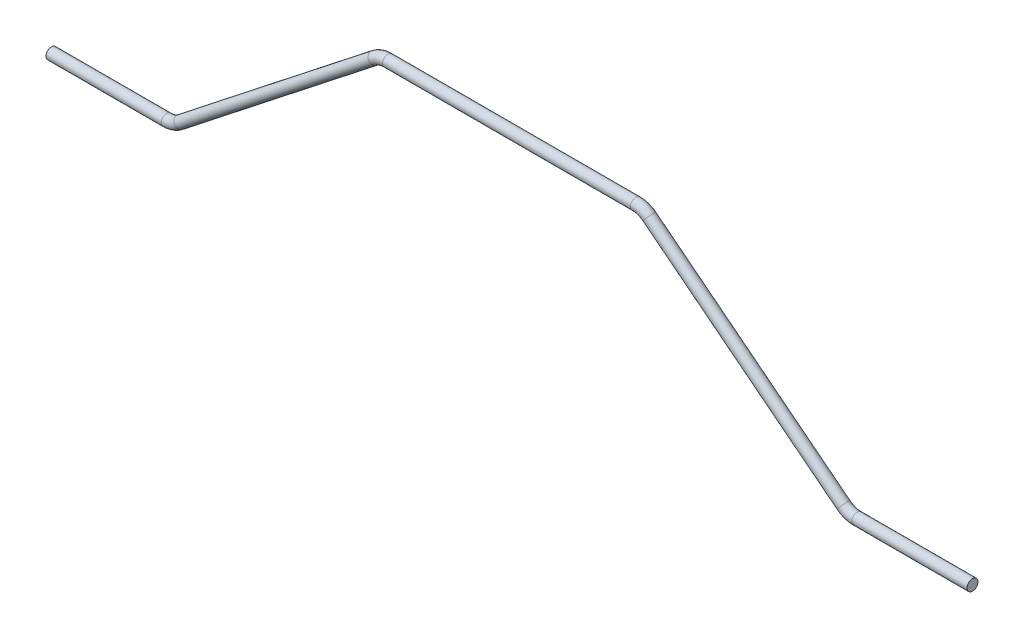
ISO-10303-21;
HEADER;
FILE_DESCRIPTION(('STEP AP214'),'2;1');
FILE_NAME('part.step','',(''),(''),'','','');
FILE_SCHEMA(('AUTOMOTIVE_DESIGN { 1 0 10303 214 1 1 1 1 }'));
ENDSEC;
DATA;
#1=APPLICATION_CONTEXT('core data for automotive mechanical design processes');
#2=APPLICATION_PROTOCOL_DEFINITION('international standard','automotive_design',2000,#1);
#3=PRODUCT_CONTEXT('',#1,'mechanical');
#4=PRODUCT('Part','Part','',(#3));
#5=PRODUCT_RELATED_PRODUCT_CATEGORY('part','',(#4));
#6=PRODUCT_DEFINITION_FORMATION('','',#4);
#7=PRODUCT_DEFINITION_CONTEXT('part definition',#1,'design');
#8=PRODUCT_DEFINITION('design','',#6,#7);
#9=PRODUCT_DEFINITION_SHAPE('','',#8);
#10=(LENGTH_UNIT() NAMED_UNIT(*) SI_UNIT(.MILLI.,.METRE.));
#11=(NAMED_UNIT(*) PLANE_ANGLE_UNIT() SI_UNIT($,.RADIAN.));
#12=(NAMED_UNIT(*) SI_UNIT($,.STERADIAN.) SOLID_ANGLE_UNIT());
#13=UNCERTAINTY_MEASURE_WITH_UNIT(LENGTH_MEASURE(1.E-05),#10,'distance_accuracy_value','');
#14=(GEOMETRIC_REPRESENTATION_CONTEXT(3) GLOBAL_UNCERTAINTY_ASSIGNED_CONTEXT((#13)) GLOBAL_UNIT_ASSIGNED_CONTEXT((#10,
#11,#12)) REPRESENTATION_CONTEXT('',''));
#15=CARTESIAN_POINT('',(0.,0.,0.));
#16=DIRECTION('',(0.,0.,1.));
#17=DIRECTION('',(1.,0.,0.));
#18=AXIS2_PLACEMENT_3D('',#15,#16,#17);
#19=CARTESIAN_POINT('',(-210.,-73.928244598278,0.));
#20=DIRECTION('',(1.,0.,0.));
#21=DIRECTION('',(0.,0.,-1.));
#22=AXIS2_PLACEMENT_3D('',#19,#20,#21);
#23=PLANE('',#22);
#24=CARTESIAN_POINT('',(-210.,-73.928244598278,0.));
#25=DIRECTION('',(1.,0.,0.));
#26=DIRECTION('',(0.,0.,-1.));
#27=AXIS2_PLACEMENT_3D('',#24,#25,#26);
#28=CIRCLE('',#27,2.5);
#29=CARTESIAN_POINT('',(-210.,-73.928244598278,-2.5));
#30=VERTEX_POINT('',#29);
#31=EDGE_CURVE('E84',#30,#30,#28,.T.);
#32=ORIENTED_EDGE('',*,*,#31,.F.);
#33=EDGE_LOOP('',(#32));
#34=FACE_BOUND('',#33,.T.);
#35=ADVANCED_FACE('F41',(#34),#23,.F.);
#36=CARTESIAN_POINT('',(210.,-73.9282445982782,0.));
#37=DIRECTION('',(1.,0.,0.));
#38=DIRECTION('',(0.,0.,-1.));
#39=AXIS2_PLACEMENT_3D('',#36,#37,#38);
#40=PLANE('',#39);
#41=CARTESIAN_POINT('',(210.,-73.9282445982782,0.));
#42=DIRECTION('',(1.,0.,0.));
#43=DIRECTION('',(0.,0.,-1.));
#44=AXIS2_PLACEMENT_3D('',#41,#42,#43);
#45=CIRCLE('',#44,2.5);
#46=CARTESIAN_POINT('',(210.,-73.9282445982782,-2.5));
#47=VERTEX_POINT('',#46);
#48=EDGE_CURVE('E10',#47,#47,#45,.T.);
#49=ORIENTED_EDGE('',*,*,#48,.T.);
#50=EDGE_LOOP('',(#49));
#51=FACE_BOUND('',#50,.T.);
#52=ADVANCED_FACE('F92',(#51),#40,.T.);
#53=CARTESIAN_POINT('',(-210.,-73.928244598278,0.));
#54=DIRECTION('',(1.,0.,0.));
#55=DIRECTION('',(0.,1.,0.));
#56=AXIS2_PLACEMENT_3D('',#53,#54,#55);
#57=CYLINDRICAL_SURFACE('',#56,2.5);
#58=CARTESIAN_POINT('',(-157.459682683287,-73.9282445982781,0.));
#59=DIRECTION('',(1.,0.,0.));
#60=DIRECTION('',(0.,0.,-1.));
#61=AXIS2_PLACEMENT_3D('',#58,#59,#60);
#62=CIRCLE('',#61,2.5);
#63=CARTESIAN_POINT('',(-157.459682683287,-76.4282445982781,0.));
#64=VERTEX_POINT('',#63);
#65=EDGE_CURVE('E80',#64,#64,#62,.T.);
#66=ORIENTED_EDGE('',*,*,#65,.F.);
#67=EDGE_LOOP('',(#66));
#68=FACE_BOUND('',#67,.T.);
#69=ORIENTED_EDGE('',*,*,#31,.T.);
#70=EDGE_LOOP('',(#69));
#71=FACE_BOUND('',#70,.T.);
#72=ADVANCED_FACE('F89',(#68,#71),#57,.T.);
#73=CARTESIAN_POINT('',(-157.459682683287,-63.8857142857143,0.));
#74=DIRECTION('',(0.,0.,1.));
#75=DIRECTION('',(1.,0.,0.));
#76=AXIS2_PLACEMENT_3D('',#73,#74,#75);
#77=TOROIDAL_SURFACE('',#76,10.0425303125638,2.5);
#78=CARTESIAN_POINT('',(-151.253707319645,-71.7811740484287,0.));
#79=DIRECTION('',(0.786202233598109,0.61796929364277,0.));
#80=DIRECTION('',(0.,0.,-1.));
#81=AXIS2_PLACEMENT_3D('',#78,#79,#80);
#82=CIRCLE('',#81,2.5);
#83=CARTESIAN_POINT('',(-149.708784085539,-73.7466796324239,0.));
#84=VERTEX_POINT('',#83);
#85=EDGE_CURVE('E76',#84,#84,#82,.T.);
#86=CARTESIAN_POINT('',(-157.459682683287,-63.8857142857143,0.));
#87=DIRECTION('',(0.,0.,1.));
#88=DIRECTION('',(1.,0.,0.));
#89=AXIS2_PLACEMENT_3D('',#86,#87,#88);
#90=CIRCLE('',#89,12.5425303125638);
#91=EDGE_CURVE('',#64,#84,#90,.T.);
#92=ORIENTED_EDGE('',*,*,#65,.T.);
#93=ORIENTED_EDGE('',*,*,#85,.F.);
#94=ORIENTED_EDGE('',*,*,#91,.T.);
#95=ORIENTED_EDGE('',*,*,#91,.F.);
#96=EDGE_LOOP('',(#92,#94,#93,#95));
#97=FACE_BOUND('',#96,.T.);
#98=ADVANCED_FACE('F126',(#97),#77,.T.);
#99=CARTESIAN_POINT('',(-151.253707319646,-71.7811740484288,0.));
#100=DIRECTION('',(0.786202233598109,0.61796929364277,0.));
#101=DIRECTION('',(-0.61796929364277,0.786202233598109,0.));
#102=AXIS2_PLACEMENT_3D('',#99,#100,#101);
#103=CYLINDRICAL_SURFACE('',#102,2.5);
#104=CARTESIAN_POINT('',(-62.6937278259274,-2.17141509075233,0.));
#105=DIRECTION('',(0.78620223359811,0.61796929364277,0.));
#106=DIRECTION('',(0.,0.,-1.));
#107=AXIS2_PLACEMENT_3D('',#104,#105,#106);
#108=CIRCLE('',#107,2.5);
#109=CARTESIAN_POINT('',(-64.2386510600343,-0.205909506757062,0.));
#110=VERTEX_POINT('',#109);
#111=EDGE_CURVE('E72',#110,#110,#108,.T.);
#112=ORIENTED_EDGE('',*,*,#111,.F.);
#113=EDGE_LOOP('',(#112));
#114=FACE_BOUND('',#113,.T.);
#115=ORIENTED_EDGE('',*,*,#85,.T.);
#116=EDGE_LOOP('',(#115));
#117=FACE_BOUND('',#116,.T.);
#118=ADVANCED_FACE('F122',(#114,#117),#103,.T.);
#119=CARTESIAN_POINT('',(-56.5403173167131,-10.,0.));
#120=DIRECTION('',(0.,0.,-1.));
#121=DIRECTION('',(-1.,0.,0.));
#122=AXIS2_PLACEMENT_3D('',#119,#120,#121);
#123=TOROIDAL_SURFACE('',#122,9.9574696874361,2.5);
#124=CARTESIAN_POINT('',(-56.5403173167131,-0.0425303125638071,0.));
#125=DIRECTION('',(1.,0.,0.));
#126=DIRECTION('',(0.,0.,-1.));
#127=AXIS2_PLACEMENT_3D('',#124,#125,#126);
#128=CIRCLE('',#127,2.5);
#129=CARTESIAN_POINT('',(-56.5403173167131,2.45746968743609,0.));
#130=VERTEX_POINT('',#129);
#131=EDGE_CURVE('E68',#130,#130,#128,.T.);
#132=CARTESIAN_POINT('',(-56.5403173167131,-10.,0.));
#133=DIRECTION('',(0.,0.,-1.));
#134=DIRECTION('',(-1.,0.,0.));
#135=AXIS2_PLACEMENT_3D('',#132,#133,#134);
#136=CIRCLE('',#135,12.4574696874361);
#137=EDGE_CURVE('',#110,#130,#136,.T.);
#138=ORIENTED_EDGE('',*,*,#111,.T.);
#139=ORIENTED_EDGE('',*,*,#131,.F.);
#140=ORIENTED_EDGE('',*,*,#137,.T.);
#141=ORIENTED_EDGE('',*,*,#137,.F.);
#142=EDGE_LOOP('',(#138,#140,#139,#141));
#143=FACE_BOUND('',#142,.T.);
#144=ADVANCED_FACE('F118',(#143),#123,.T.);
#145=CARTESIAN_POINT('',(-56.5403173167131,-0.0425303125638349,0.));
#146=DIRECTION('',(1.,0.,0.));
#147=DIRECTION('',(0.,1.,0.));
#148=AXIS2_PLACEMENT_3D('',#145,#146,#147);
#149=CYLINDRICAL_SURFACE('',#148,2.5);
#150=CARTESIAN_POINT('',(56.5403173167132,-0.042530312563821,0.));
#151=DIRECTION('',(1.,0.,0.));
#152=DIRECTION('',(0.,0.,-1.));
#153=AXIS2_PLACEMENT_3D('',#150,#151,#152);
#154=CIRCLE('',#153,2.5);
#155=CARTESIAN_POINT('',(56.5403173167132,2.45746968743621,0.));
#156=VERTEX_POINT('',#155);
#157=EDGE_CURVE('E64',#156,#156,#154,.T.);
#158=ORIENTED_EDGE('',*,*,#157,.F.);
#159=EDGE_LOOP('',(#158));
#160=FACE_BOUND('',#159,.T.);
#161=ORIENTED_EDGE('',*,*,#131,.T.);
#162=EDGE_LOOP('',(#161));
#163=FACE_BOUND('',#162,.T.);
#164=ADVANCED_FACE('F114',(#160,#163),#149,.T.);
#165=CARTESIAN_POINT('',(56.5403173167131,-10.,0.));
#166=DIRECTION('',(0.,0.,-1.));
#167=DIRECTION('',(-1.,0.,0.));
#168=AXIS2_PLACEMENT_3D('',#165,#166,#167);
#169=TOROIDAL_SURFACE('',#168,9.95746968743621,2.5);
#170=CARTESIAN_POINT('',(62.6937278259273,-2.17141509075228,0.));
#171=DIRECTION('',(0.786202233598109,-0.61796929364277,0.));
#172=DIRECTION('',(0.,0.,-1.));
#173=AXIS2_PLACEMENT_3D('',#170,#171,#172);
#174=CIRCLE('',#173,2.5);
#175=CARTESIAN_POINT('',(64.2386510600343,-0.205909506756908,0.));
#176=VERTEX_POINT('',#175);
#177=EDGE_CURVE('E58',#176,#176,#174,.T.);
#178=CARTESIAN_POINT('',(56.5403173167131,-10.,0.));
#179=DIRECTION('',(0.,0.,-1.));
#180=DIRECTION('',(-1.,0.,0.));
#181=AXIS2_PLACEMENT_3D('',#178,#179,#180);
#182=CIRCLE('',#181,12.4574696874362);
#183=EDGE_CURVE('',#156,#176,#182,.T.);
#184=ORIENTED_EDGE('',*,*,#157,.T.);
#185=ORIENTED_EDGE('',*,*,#177,.F.);
#186=ORIENTED_EDGE('',*,*,#183,.T.);
#187=ORIENTED_EDGE('',*,*,#183,.F.);
#188=EDGE_LOOP('',(#184,#186,#185,#187));
#189=FACE_BOUND('',#188,.T.);
#190=ADVANCED_FACE('F110',(#189),#169,.T.);
#191=CARTESIAN_POINT('',(62.6937278259273,-2.1714150907523,0.));
#192=DIRECTION('',(0.786202233598109,-0.61796929364277,0.));
#193=DIRECTION('',(0.61796929364277,0.786202233598109,0.));
#194=AXIS2_PLACEMENT_3D('',#191,#192,#193);
#195=CYLINDRICAL_SURFACE('',#194,2.5);
#196=CARTESIAN_POINT('',(151.253707319645,-71.7811740484288,0.));
#197=DIRECTION('',(0.786202233598109,-0.61796929364277,0.));
#198=DIRECTION('',(0.,0.,-1.));
#199=AXIS2_PLACEMENT_3D('',#196,#197,#198);
#200=CIRCLE('',#199,2.5);
#201=CARTESIAN_POINT('',(149.708784085539,-73.746679632424,0.));
#202=VERTEX_POINT('',#201);
#203=EDGE_CURVE('E53',#202,#202,#200,.T.);
#204=ORIENTED_EDGE('',*,*,#203,.F.);
#205=EDGE_LOOP('',(#204));
#206=FACE_BOUND('',#205,.T.);
#207=ORIENTED_EDGE('',*,*,#177,.T.);
#208=EDGE_LOOP('',(#207));
#209=FACE_BOUND('',#208,.T.);
#210=ADVANCED_FACE('F104',(#206,#209),#195,.T.);
#211=CARTESIAN_POINT('',(157.459682683287,-63.8857142857143,0.));
#212=DIRECTION('',(0.,0.,1.));
#213=DIRECTION('',(1.,0.,0.));
#214=AXIS2_PLACEMENT_3D('',#211,#212,#213);
#215=TOROIDAL_SURFACE('',#214,10.0425303125639,2.5);
#216=CARTESIAN_POINT('',(157.459682683287,-73.9282445982781,0.));
#217=DIRECTION('',(1.,0.,0.));
#218=DIRECTION('',(0.,0.,-1.));
#219=AXIS2_PLACEMENT_3D('',#216,#217,#218);
#220=CIRCLE('',#219,2.5);
#221=CARTESIAN_POINT('',(157.459682683287,-76.4282445982782,0.));
#222=VERTEX_POINT('',#221);
#223=EDGE_CURVE('E48',#222,#222,#220,.T.);
#224=CARTESIAN_POINT('',(157.459682683287,-63.8857142857143,0.));
#225=DIRECTION('',(0.,0.,1.));
#226=DIRECTION('',(1.,0.,0.));
#227=AXIS2_PLACEMENT_3D('',#224,#225,#226);
#228=CIRCLE('',#227,12.5425303125639);
#229=EDGE_CURVE('',#202,#222,#228,.T.);
#230=ORIENTED_EDGE('',*,*,#203,.T.);
#231=ORIENTED_EDGE('',*,*,#223,.F.);
#232=ORIENTED_EDGE('',*,*,#229,.T.);
#233=ORIENTED_EDGE('',*,*,#229,.F.);
#234=EDGE_LOOP('',(#230,#232,#231,#233));
#235=FACE_BOUND('',#234,.T.);
#236=ADVANCED_FACE('F98',(#235),#215,.T.);
#237=CARTESIAN_POINT('',(157.459682683287,-73.9282445982782,0.));
#238=DIRECTION('',(1.,0.,0.));
#239=DIRECTION('',(0.,1.,0.));
#240=AXIS2_PLACEMENT_3D('',#237,#238,#239);
#241=CYLINDRICAL_SURFACE('',#240,2.5);
#242=ORIENTED_EDGE('',*,*,#48,.F.);
#243=EDGE_LOOP('',(#242));
#244=FACE_BOUND('',#243,.T.);
#245=ORIENTED_EDGE('',*,*,#223,.T.);
#246=EDGE_LOOP('',(#245));
#247=FACE_BOUND('',#246,.T.);
#248=ADVANCED_FACE('F96',(#244,#247),#241,.T.);
#249=CLOSED_SHELL('',(#35,#52,#72,#98,#118,#144,#164,#190,#210,#236,#248));
#250=MANIFOLD_SOLID_BREP('B2',#249);
#251=ADVANCED_BREP_SHAPE_REPRESENTATION('',(#18,#250),#14);
#252=SHAPE_DEFINITION_REPRESENTATION(#9,#251);
ENDSEC;
END-ISO-10303-21;
